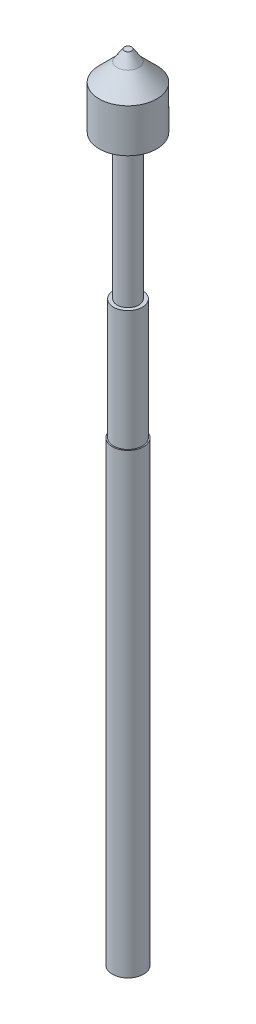
ISO-10303-21;
HEADER;
FILE_DESCRIPTION(('STEP AP214'),'2;1');
FILE_NAME('part.step','',(''),(''),'','','');
FILE_SCHEMA(('AUTOMOTIVE_DESIGN { 1 0 10303 214 1 1 1 1 }'));
ENDSEC;
DATA;
#1=APPLICATION_CONTEXT('core data for automotive mechanical design processes');
#2=APPLICATION_PROTOCOL_DEFINITION('international standard','automotive_design',2000,#1);
#3=PRODUCT_CONTEXT('',#1,'mechanical');
#4=PRODUCT('Part','Part','',(#3));
#5=PRODUCT_RELATED_PRODUCT_CATEGORY('part','',(#4));
#6=PRODUCT_DEFINITION_FORMATION('','',#4);
#7=PRODUCT_DEFINITION_CONTEXT('part definition',#1,'design');
#8=PRODUCT_DEFINITION('design','',#6,#7);
#9=PRODUCT_DEFINITION_SHAPE('','',#8);
#10=(LENGTH_UNIT() NAMED_UNIT(*) SI_UNIT(.MILLI.,.METRE.));
#11=(NAMED_UNIT(*) PLANE_ANGLE_UNIT() SI_UNIT($,.RADIAN.));
#12=(NAMED_UNIT(*) SI_UNIT($,.STERADIAN.) SOLID_ANGLE_UNIT());
#13=UNCERTAINTY_MEASURE_WITH_UNIT(LENGTH_MEASURE(1.E-05),#10,'distance_accuracy_value','');
#14=(GEOMETRIC_REPRESENTATION_CONTEXT(3) GLOBAL_UNCERTAINTY_ASSIGNED_CONTEXT((#13)) GLOBAL_UNIT_ASSIGNED_CONTEXT((#10,
#11,#12)) REPRESENTATION_CONTEXT('',''));
#15=CARTESIAN_POINT('',(0.,0.,0.));
#16=DIRECTION('',(0.,0.,1.));
#17=DIRECTION('',(1.,0.,0.));
#18=AXIS2_PLACEMENT_3D('',#15,#16,#17);
#19=CARTESIAN_POINT('',(0.,33.,0.));
#20=DIRECTION('',(0.,-1.,0.));
#21=DIRECTION('',(0.,0.,-1.));
#22=AXIS2_PLACEMENT_3D('',#19,#20,#21);
#23=CYLINDRICAL_SURFACE('',#22,0.45);
#24=CARTESIAN_POINT('',(0.,30.,0.));
#25=DIRECTION('',(0.,-1.,0.));
#26=DIRECTION('',(1.,0.,0.));
#27=AXIS2_PLACEMENT_3D('',#24,#25,#26);
#28=CIRCLE('',#27,0.45);
#29=CARTESIAN_POINT('',(0.45,30.,0.));
#30=VERTEX_POINT('',#29);
#31=EDGE_CURVE('E55',#30,#30,#28,.T.);
#32=ORIENTED_EDGE('',*,*,#31,.T.);
#33=EDGE_LOOP('',(#32));
#34=FACE_BOUND('',#33,.T.);
#35=CARTESIAN_POINT('',(0.,24.,0.));
#36=DIRECTION('',(0.,1.,0.));
#37=DIRECTION('',(0.,0.,1.));
#38=AXIS2_PLACEMENT_3D('',#35,#36,#37);
#39=CIRCLE('',#38,0.45);
#40=CARTESIAN_POINT('',(0.,24.,0.45));
#41=VERTEX_POINT('',#40);
#42=EDGE_CURVE('E11',#41,#41,#39,.T.);
#43=ORIENTED_EDGE('',*,*,#42,.T.);
#44=EDGE_LOOP('',(#43));
#45=FACE_BOUND('',#44,.T.);
#46=ADVANCED_FACE('F51',(#34,#45),#23,.T.);
#47=CARTESIAN_POINT('',(0.,19.,0.));
#48=DIRECTION('',(0.,-1.,0.));
#49=DIRECTION('',(0.,0.,-1.));
#50=AXIS2_PLACEMENT_3D('',#47,#48,#49);
#51=CYLINDRICAL_SURFACE('',#50,0.65);
#52=CARTESIAN_POINT('',(0.,19.,0.));
#53=DIRECTION('',(0.,1.,0.));
#54=DIRECTION('',(0.,0.,1.));
#55=AXIS2_PLACEMENT_3D('',#52,#53,#54);
#56=CIRCLE('',#55,0.65);
#57=CARTESIAN_POINT('',(0.,19.,0.65));
#58=VERTEX_POINT('',#57);
#59=EDGE_CURVE('E96',#58,#58,#56,.T.);
#60=ORIENTED_EDGE('',*,*,#59,.F.);
#61=EDGE_LOOP('',(#60));
#62=FACE_BOUND('',#61,.T.);
#63=CARTESIAN_POINT('',(0.,0.,0.));
#64=DIRECTION('',(0.,1.,0.));
#65=DIRECTION('',(0.,0.,1.));
#66=AXIS2_PLACEMENT_3D('',#63,#64,#65);
#67=CIRCLE('',#66,0.65);
#68=CARTESIAN_POINT('',(0.,0.,0.65));
#69=VERTEX_POINT('',#68);
#70=EDGE_CURVE('E92',#69,#69,#67,.T.);
#71=ORIENTED_EDGE('',*,*,#70,.T.);
#72=EDGE_LOOP('',(#71));
#73=FACE_BOUND('',#72,.T.);
#74=ADVANCED_FACE('F53',(#62,#73),#51,.T.);
#75=CARTESIAN_POINT('',(0.,19.,0.));
#76=DIRECTION('',(0.,1.,0.));
#77=DIRECTION('',(0.,0.,1.));
#78=AXIS2_PLACEMENT_3D('',#75,#76,#77);
#79=PLANE('',#78);
#80=CARTESIAN_POINT('',(0.,19.,0.));
#81=DIRECTION('',(0.,1.,0.));
#82=DIRECTION('',(0.,0.,1.));
#83=AXIS2_PLACEMENT_3D('',#80,#81,#82);
#84=CIRCLE('',#83,0.6);
#85=CARTESIAN_POINT('',(0.,19.,0.6));
#86=VERTEX_POINT('',#85);
#87=EDGE_CURVE('E60',#86,#86,#84,.T.);
#88=ORIENTED_EDGE('',*,*,#87,.F.);
#89=EDGE_LOOP('',(#88));
#90=FACE_BOUND('',#89,.T.);
#91=ORIENTED_EDGE('',*,*,#59,.T.);
#92=EDGE_LOOP('',(#91));
#93=FACE_BOUND('',#92,.T.);
#94=ADVANCED_FACE('F107',(#90,#93),#79,.T.);
#95=CARTESIAN_POINT('',(0.,0.,0.));
#96=DIRECTION('',(0.,1.,0.));
#97=DIRECTION('',(0.,0.,1.));
#98=AXIS2_PLACEMENT_3D('',#95,#96,#97);
#99=PLANE('',#98);
#100=ORIENTED_EDGE('',*,*,#70,.F.);
#101=EDGE_LOOP('',(#100));
#102=FACE_BOUND('',#101,.T.);
#103=ADVANCED_FACE('F104',(#102),#99,.F.);
#104=CARTESIAN_POINT('',(0.,24.,0.));
#105=DIRECTION('',(0.,-1.,0.));
#106=DIRECTION('',(0.,0.,-1.));
#107=AXIS2_PLACEMENT_3D('',#104,#105,#106);
#108=CYLINDRICAL_SURFACE('',#107,0.6);
#109=CARTESIAN_POINT('',(0.,24.,0.));
#110=DIRECTION('',(0.,1.,0.));
#111=DIRECTION('',(0.,0.,1.));
#112=AXIS2_PLACEMENT_3D('',#109,#110,#111);
#113=CIRCLE('',#112,0.6);
#114=CARTESIAN_POINT('',(0.,24.,0.6));
#115=VERTEX_POINT('',#114);
#116=EDGE_CURVE('E88',#115,#115,#113,.T.);
#117=ORIENTED_EDGE('',*,*,#116,.F.);
#118=EDGE_LOOP('',(#117));
#119=FACE_BOUND('',#118,.T.);
#120=ORIENTED_EDGE('',*,*,#87,.T.);
#121=EDGE_LOOP('',(#120));
#122=FACE_BOUND('',#121,.T.);
#123=ADVANCED_FACE('F106',(#119,#122),#108,.T.);
#124=CARTESIAN_POINT('',(0.,24.,0.));
#125=DIRECTION('',(0.,1.,0.));
#126=DIRECTION('',(0.,0.,1.));
#127=AXIS2_PLACEMENT_3D('',#124,#125,#126);
#128=PLANE('',#127);
#129=ORIENTED_EDGE('',*,*,#42,.F.);
#130=EDGE_LOOP('',(#129));
#131=FACE_BOUND('',#130,.T.);
#132=ORIENTED_EDGE('',*,*,#116,.T.);
#133=EDGE_LOOP('',(#132));
#134=FACE_BOUND('',#133,.T.);
#135=ADVANCED_FACE('F113',(#131,#134),#128,.T.);
#136=CARTESIAN_POINT('',(0.,33.,0.));
#137=DIRECTION('',(0.,-1.,0.));
#138=DIRECTION('',(1.,0.,0.));
#139=AXIS2_PLACEMENT_3D('',#136,#137,#138);
#140=CONICAL_SURFACE('',#139,0.,0.785398163397446);
#141=CARTESIAN_POINT('',(0.,31.8,0.));
#142=DIRECTION('',(0.,1.,0.));
#143=DIRECTION('',(-1.,0.,0.));
#144=AXIS2_PLACEMENT_3D('',#141,#142,#143);
#145=CIRCLE('',#144,1.2);
#146=CARTESIAN_POINT('',(-1.2,31.8,0.));
#147=VERTEX_POINT('',#146);
#148=EDGE_CURVE('E74',#147,#147,#145,.T.);
#149=ORIENTED_EDGE('',*,*,#148,.T.);
#150=EDGE_LOOP('',(#149));
#151=FACE_BOUND('',#150,.T.);
#152=CARTESIAN_POINT('',(0.,32.55,0.));
#153=DIRECTION('',(0.,1.,0.));
#154=DIRECTION('',(-1.,0.,0.));
#155=AXIS2_PLACEMENT_3D('',#152,#153,#154);
#156=CIRCLE('',#155,0.450000000000005);
#157=CARTESIAN_POINT('',(0.449999999999998,32.55,0.));
#158=VERTEX_POINT('',#157);
#159=EDGE_CURVE('E75',#158,#158,#156,.T.);
#160=ORIENTED_EDGE('',*,*,#159,.F.);
#161=EDGE_LOOP('',(#160));
#162=FACE_BOUND('',#161,.T.);
#163=ADVANCED_FACE('F130',(#151,#162),#140,.T.);
#164=CARTESIAN_POINT('',(-1.2,30.,0.));
#165=DIRECTION('',(0.,-1.,0.));
#166=DIRECTION('',(1.,0.,0.));
#167=AXIS2_PLACEMENT_3D('',#164,#165,#166);
#168=PLANE('',#167);
#169=ORIENTED_EDGE('',*,*,#31,.F.);
#170=EDGE_LOOP('',(#169));
#171=FACE_BOUND('',#170,.T.);
#172=CARTESIAN_POINT('',(0.,30.,0.));
#173=DIRECTION('',(0.,1.,0.));
#174=DIRECTION('',(-1.,0.,0.));
#175=AXIS2_PLACEMENT_3D('',#172,#173,#174);
#176=CIRCLE('',#175,1.2);
#177=CARTESIAN_POINT('',(-1.2,30.,0.));
#178=VERTEX_POINT('',#177);
#179=EDGE_CURVE('E80',#178,#178,#176,.T.);
#180=ORIENTED_EDGE('',*,*,#179,.F.);
#181=EDGE_LOOP('',(#180));
#182=FACE_BOUND('',#181,.T.);
#183=ADVANCED_FACE('F135',(#171,#182),#168,.T.);
#184=CARTESIAN_POINT('',(0.,0.,0.));
#185=DIRECTION('',(0.,1.,0.));
#186=DIRECTION('',(-1.,0.,0.));
#187=AXIS2_PLACEMENT_3D('',#184,#185,#186);
#188=CYLINDRICAL_SURFACE('',#187,1.2);
#189=ORIENTED_EDGE('',*,*,#179,.T.);
#190=EDGE_LOOP('',(#189));
#191=FACE_BOUND('',#190,.T.);
#192=ORIENTED_EDGE('',*,*,#148,.F.);
#193=EDGE_LOOP('',(#192));
#194=FACE_BOUND('',#193,.T.);
#195=ADVANCED_FACE('F148',(#191,#194),#188,.T.);
#196=CARTESIAN_POINT('',(0.,33.,0.));
#197=DIRECTION('',(0.,-1.,0.));
#198=DIRECTION('',(1.,0.,0.));
#199=AXIS2_PLACEMENT_3D('',#196,#197,#198);
#200=CONICAL_SURFACE('',#199,0.150000000000005,0.588002603547568);
#201=CARTESIAN_POINT('',(0.,33.,0.));
#202=DIRECTION('',(0.,1.,0.));
#203=DIRECTION('',(-1.,0.,0.));
#204=AXIS2_PLACEMENT_3D('',#201,#202,#203);
#205=CIRCLE('',#204,0.150000000000005);
#206=CARTESIAN_POINT('',(0.149999999999998,33.,0.));
#207=VERTEX_POINT('',#206);
#208=EDGE_CURVE('E71',#207,#207,#205,.T.);
#209=CARTESIAN_POINT('',(0.449999999999998,32.55,0.));
#210=CARTESIAN_POINT('',(0.446874999999997,32.5546875,0.));
#211=CARTESIAN_POINT('',(0.443749999999997,32.559375,0.));
#212=CARTESIAN_POINT('',(0.437499999999997,32.56875,0.));
#213=CARTESIAN_POINT('',(0.434374999999997,32.5734375,0.));
#214=CARTESIAN_POINT('',(0.428124999999998,32.5828125,0.));
#215=CARTESIAN_POINT('',(0.424999999999998,32.5875,0.));
#216=CARTESIAN_POINT('',(0.418749999999998,32.596875,0.));
#217=CARTESIAN_POINT('',(0.415624999999997,32.6015625,0.));
#218=CARTESIAN_POINT('',(0.409374999999997,32.6109375,0.));
#219=CARTESIAN_POINT('',(0.406249999999998,32.615625,0.));
#220=CARTESIAN_POINT('',(0.399999999999998,32.625,0.));
#221=CARTESIAN_POINT('',(0.396874999999998,32.6296875,0.));
#222=CARTESIAN_POINT('',(0.390624999999998,32.6390625,0.));
#223=CARTESIAN_POINT('',(0.387499999999998,32.64375,0.));
#224=CARTESIAN_POINT('',(0.381249999999998,32.653125,0.));
#225=CARTESIAN_POINT('',(0.378124999999997,32.6578125,0.));
#226=CARTESIAN_POINT('',(0.371874999999997,32.6671875,0.));
#227=CARTESIAN_POINT('',(0.368749999999997,32.671875,0.));
#228=CARTESIAN_POINT('',(0.362499999999998,32.68125,0.));
#229=CARTESIAN_POINT('',(0.359374999999998,32.6859375,0.));
#230=CARTESIAN_POINT('',(0.353124999999998,32.6953125,0.));
#231=CARTESIAN_POINT('',(0.349999999999997,32.7,0.));
#232=CARTESIAN_POINT('',(0.343749999999997,32.709375,0.));
#233=CARTESIAN_POINT('',(0.340624999999998,32.7140625,0.));
#234=CARTESIAN_POINT('',(0.334374999999998,32.7234375,0.));
#235=CARTESIAN_POINT('',(0.331249999999998,32.728125,0.));
#236=CARTESIAN_POINT('',(0.324999999999998,32.7375,0.));
#237=CARTESIAN_POINT('',(0.321874999999998,32.7421875,0.));
#238=CARTESIAN_POINT('',(0.315624999999998,32.7515625,0.));
#239=CARTESIAN_POINT('',(0.312499999999997,32.75625,0.));
#240=CARTESIAN_POINT('',(0.306249999999997,32.765625,0.));
#241=CARTESIAN_POINT('',(0.303124999999997,32.7703125,0.));
#242=CARTESIAN_POINT('',(0.296874999999998,32.7796875,0.));
#243=CARTESIAN_POINT('',(0.293749999999999,32.784375,0.));
#244=CARTESIAN_POINT('',(0.287499999999998,32.79375,0.));
#245=CARTESIAN_POINT('',(0.284374999999997,32.7984375,0.));
#246=CARTESIAN_POINT('',(0.278124999999997,32.8078125,0.));
#247=CARTESIAN_POINT('',(0.274999999999998,32.8125,0.));
#248=CARTESIAN_POINT('',(0.268749999999998,32.821875,0.));
#249=CARTESIAN_POINT('',(0.265624999999998,32.8265625,0.));
#250=CARTESIAN_POINT('',(0.259374999999998,32.8359375,0.));
#251=CARTESIAN_POINT('',(0.256249999999998,32.840625,0.));
#252=CARTESIAN_POINT('',(0.249999999999998,32.85,0.));
#253=CARTESIAN_POINT('',(0.246874999999997,32.8546875,0.));
#254=CARTESIAN_POINT('',(0.240624999999997,32.8640625,0.));
#255=CARTESIAN_POINT('',(0.237499999999997,32.86875,0.));
#256=CARTESIAN_POINT('',(0.231249999999998,32.878125,0.));
#257=CARTESIAN_POINT('',(0.228124999999998,32.8828125,0.));
#258=CARTESIAN_POINT('',(0.221874999999998,32.8921875,0.));
#259=CARTESIAN_POINT('',(0.218749999999997,32.896875,0.));
#260=CARTESIAN_POINT('',(0.212499999999997,32.90625,0.));
#261=CARTESIAN_POINT('',(0.209374999999998,32.9109375,0.));
#262=CARTESIAN_POINT('',(0.203124999999998,32.9203125,0.));
#263=CARTESIAN_POINT('',(0.199999999999998,32.925,0.));
#264=CARTESIAN_POINT('',(0.193749999999998,32.934375,0.));
#265=CARTESIAN_POINT('',(0.190624999999998,32.9390625,0.));
#266=CARTESIAN_POINT('',(0.184374999999998,32.9484375,0.));
#267=CARTESIAN_POINT('',(0.181249999999997,32.953125,0.));
#268=CARTESIAN_POINT('',(0.174999999999997,32.9625,0.));
#269=CARTESIAN_POINT('',(0.171874999999997,32.9671875,0.));
#270=CARTESIAN_POINT('',(0.165624999999998,32.9765625,0.));
#271=CARTESIAN_POINT('',(0.162499999999998,32.98125,0.));
#272=CARTESIAN_POINT('',(0.156249999999998,32.990625,0.));
#273=CARTESIAN_POINT('',(0.153124999999999,32.9953125,0.));
#274=CARTESIAN_POINT('',(0.149999999999998,33.,0.));
#275=B_SPLINE_CURVE_WITH_KNOTS('',3,(#209,#210,#211,#212,#213,#214,#215,#216,#217,#218,#219,
#220,#221,#222,#223,#224,#225,#226,#227,#228,#229,#230,#231,#232,#233,#234,#235,#236,#237,#238,
#239,#240,#241,#242,#243,#244,#245,#246,#247,#248,#249,#250,#251,#252,#253,#254,#255,#256,#257,
#258,#259,#260,#261,#262,#263,#264,#265,#266,#267,#268,#269,#270,#271,#272,#273,#274),
.UNSPECIFIED.,.F.,.F.,(4,2,2,2,2,2,2,2,2,2,2,2,2,2,2,2,2,2,2,2,2,2,2,2,2,2,2,2,2,2,2,2,4),(0.,
0.0169010216037333,0.0338020432074723,0.0507030648112114,0.0676040864149446,0.0845051080186837,
0.101406129622423,0.118307151226162,0.135208172829895,0.152109194433634,0.169010216037373,
0.185911237641106,0.202812259244845,0.219713280848585,0.236614302452324,0.253515324056057,
0.270416345659796,0.287317367263535,0.304218388867268,0.321119410471007,0.338020432074746,
0.354921453678485,0.371822475282219,0.388723496885958,0.405624518489697,0.42252554009343,
0.439426561697169,0.456327583300908,0.473228604904647,0.49012962650838,0.507030648112119,
0.523931669715858,0.540832691319592),.UNSPECIFIED.);
#276=EDGE_CURVE('BSEAM67',#158,#207,#275,.T.);
#277=ORIENTED_EDGE('',*,*,#159,.T.);
#278=ORIENTED_EDGE('',*,*,#208,.F.);
#279=ORIENTED_EDGE('',*,*,#276,.T.);
#280=ORIENTED_EDGE('',*,*,#276,.F.);
#281=EDGE_LOOP('',(#277,#279,#278,#280));
#282=FACE_BOUND('',#281,.T.);
#283=ADVANCED_FACE('F67',(#282),#200,.T.);
#284=CARTESIAN_POINT('',(0.,33.,0.));
#285=DIRECTION('',(0.,1.,0.));
#286=DIRECTION('',(0.,0.,1.));
#287=AXIS2_PLACEMENT_3D('',#284,#285,#286);
#288=PLANE('',#287);
#289=CARTESIAN_POINT('',(0.,33.,0.));
#290=VERTEX_POINT('',#289);
#291=VERTEX_LOOP('',#290);
#292=FACE_BOUND('',#291,.T.);
#293=ORIENTED_EDGE('',*,*,#208,.T.);
#294=EDGE_LOOP('',(#293));
#295=FACE_BOUND('',#294,.T.);
#296=ADVANCED_FACE('F64',(#292,#295),#288,.T.);
#297=CLOSED_SHELL('',(#46,#74,#94,#103,#123,#135,#163,#183,#195,#283,#296));
#298=MANIFOLD_SOLID_BREP('B2',#297);
#299=ADVANCED_BREP_SHAPE_REPRESENTATION('',(#18,#298),#14);
#300=SHAPE_DEFINITION_REPRESENTATION(#9,#299);
ENDSEC;
END-ISO-10303-21;
